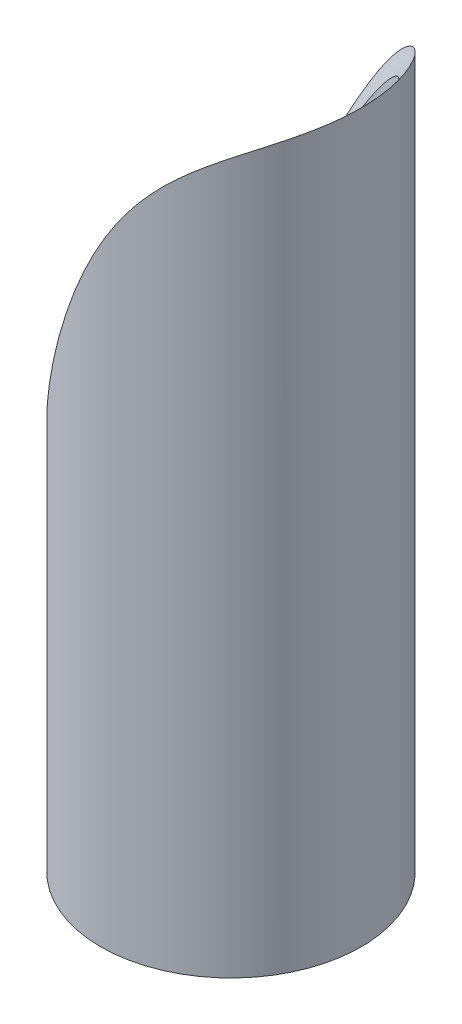
ISO-10303-21;
HEADER;
FILE_DESCRIPTION(('STEP AP214'),'2;1');
FILE_NAME('part.step','',(''),(''),'','','');
FILE_SCHEMA(('AUTOMOTIVE_DESIGN { 1 0 10303 214 1 1 1 1 }'));
ENDSEC;
DATA;
#1=APPLICATION_CONTEXT('core data for automotive mechanical design processes');
#2=APPLICATION_PROTOCOL_DEFINITION('international standard','automotive_design',2000,#1);
#3=PRODUCT_CONTEXT('',#1,'mechanical');
#4=PRODUCT('Part','Part','',(#3));
#5=PRODUCT_RELATED_PRODUCT_CATEGORY('part','',(#4));
#6=PRODUCT_DEFINITION_FORMATION('','',#4);
#7=PRODUCT_DEFINITION_CONTEXT('part definition',#1,'design');
#8=PRODUCT_DEFINITION('design','',#6,#7);
#9=PRODUCT_DEFINITION_SHAPE('','',#8);
#10=(LENGTH_UNIT() NAMED_UNIT(*) SI_UNIT(.MILLI.,.METRE.));
#11=(NAMED_UNIT(*) PLANE_ANGLE_UNIT() SI_UNIT($,.RADIAN.));
#12=(NAMED_UNIT(*) SI_UNIT($,.STERADIAN.) SOLID_ANGLE_UNIT());
#13=UNCERTAINTY_MEASURE_WITH_UNIT(LENGTH_MEASURE(1.E-05),#10,'distance_accuracy_value','');
#14=(GEOMETRIC_REPRESENTATION_CONTEXT(3) GLOBAL_UNCERTAINTY_ASSIGNED_CONTEXT((#13)) GLOBAL_UNIT_ASSIGNED_CONTEXT((#10,
#11,#12)) REPRESENTATION_CONTEXT('',''));
#15=CARTESIAN_POINT('',(0.,0.,0.));
#16=DIRECTION('',(0.,0.,1.));
#17=DIRECTION('',(1.,0.,0.));
#18=AXIS2_PLACEMENT_3D('',#15,#16,#17);
#19=CARTESIAN_POINT('',(0.,0.,0.));
#20=DIRECTION('',(0.,1.,0.));
#21=DIRECTION('',(0.,0.,1.));
#22=AXIS2_PLACEMENT_3D('',#19,#20,#21);
#23=PLANE('',#22);
#24=CARTESIAN_POINT('',(0.,0.,0.));
#25=DIRECTION('',(0.,1.,0.));
#26=DIRECTION('',(0.,0.,1.));
#27=AXIS2_PLACEMENT_3D('',#24,#25,#26);
#28=CIRCLE('',#27,11.25);
#29=CARTESIAN_POINT('',(0.,0.,11.25));
#30=VERTEX_POINT('',#29);
#31=EDGE_CURVE('E10',#30,#30,#28,.T.);
#32=ORIENTED_EDGE('',*,*,#31,.F.);
#33=EDGE_LOOP('',(#32));
#34=FACE_BOUND('',#33,.T.);
#35=CARTESIAN_POINT('',(0.,0.,0.));
#36=DIRECTION('',(0.,1.,0.));
#37=DIRECTION('',(0.,0.,1.));
#38=AXIS2_PLACEMENT_3D('',#35,#36,#37);
#39=CIRCLE('',#38,10.25);
#40=CARTESIAN_POINT('',(0.,0.,10.25));
#41=VERTEX_POINT('',#40);
#42=EDGE_CURVE('E45',#41,#41,#39,.T.);
#43=ORIENTED_EDGE('',*,*,#42,.T.);
#44=EDGE_LOOP('',(#43));
#45=FACE_BOUND('',#44,.T.);
#46=ADVANCED_FACE('F31',(#34,#45),#23,.F.);
#47=CARTESIAN_POINT('',(0.,75.,0.));
#48=DIRECTION('',(0.,-1.,0.));
#49=DIRECTION('',(0.,0.,-1.));
#50=AXIS2_PLACEMENT_3D('',#47,#48,#49);
#51=CYLINDRICAL_SURFACE('',#50,11.25);
#52=CARTESIAN_POINT('',(0.,52.5988281556523,-11.25));
#53=CARTESIAN_POINT('',(0.154801407257607,52.8669507870614,-11.2499989716801));
#54=CARTESIAN_POINT('',(0.312378840136446,53.133471297798,-11.2468104853832));
#55=CARTESIAN_POINT('',(0.633565079719813,53.6626809535256,-11.2332960558439));
#56=CARTESIAN_POINT('',(0.797173792240837,53.9253701582563,-11.2229702240124));
#57=CARTESIAN_POINT('',(1.13100626564445,54.4463302275152,-11.1942580096285));
#58=CARTESIAN_POINT('',(1.30123438401526,54.7045980146922,-11.1758662325896));
#59=CARTESIAN_POINT('',(1.64863900171999,55.2156076347191,-11.1299233075538));
#60=CARTESIAN_POINT('',(1.82581541809559,55.4683495334885,-11.1023722688834));
#61=CARTESIAN_POINT('',(2.1858285061009,55.9649346486813,-11.0371109181561));
#62=CARTESIAN_POINT('',(2.36859923755106,56.2088377971313,-10.9994950487372));
#63=CARTESIAN_POINT('',(2.74151209604992,56.6888654517424,-10.9125281841566));
#64=CARTESIAN_POINT('',(2.93165482616974,56.9249893185794,-10.8631762272141));
#65=CARTESIAN_POINT('',(3.31895617134235,57.3876191803884,-10.7511676732633));
#66=CARTESIAN_POINT('',(3.51610451896624,57.6141382635757,-10.6885299285886));
#67=CARTESIAN_POINT('',(3.91716008901634,58.0561656663875,-10.5481500682787));
#68=CARTESIAN_POINT('',(4.12106493762019,58.2716777869549,-10.4704132118462));
#69=CARTESIAN_POINT('',(4.52854076339341,58.6837131863164,-10.3005850133507));
#70=CARTESIAN_POINT('',(4.73193858617471,58.8806119941544,-10.2089937193226));
#71=CARTESIAN_POINT('',(5.14280212673697,59.2607918168509,-10.0083131205793));
#72=CARTESIAN_POINT('',(5.35026733869502,59.4440745116096,-9.89922597969307));
#73=CARTESIAN_POINT('',(5.7673230727904,59.7956270088654,-9.66219481312206));
#74=CARTESIAN_POINT('',(5.97691422352053,59.9638922178577,-9.53424504931277));
#75=CARTESIAN_POINT('',(6.39556660881948,60.2842053109016,-9.25861843849443));
#76=CARTESIAN_POINT('',(6.60462783800763,60.4362530309245,-9.1109413919916));
#77=CARTESIAN_POINT('',(7.0202870752239,60.7242256794018,-8.79469166711921));
#78=CARTESIAN_POINT('',(7.22686647243657,60.8600620896187,-8.62601370347082));
#79=CARTESIAN_POINT('',(7.63317101579305,61.1146018455879,-8.26863887816528));
#80=CARTESIAN_POINT('',(7.83289603614109,61.2333048770259,-8.07994164936192));
#81=CARTESIAN_POINT('',(8.22232302560067,61.4540995088251,-7.68330487184453));
#82=CARTESIAN_POINT('',(8.41202142821402,61.556185224854,-7.47535854757448));
#83=CARTESIAN_POINT('',(8.77832569537343,61.7446397751517,-7.0415958772153));
#84=CARTESIAN_POINT('',(8.95493191055195,61.8310090304259,-6.81578001003998));
#85=CARTESIAN_POINT('',(9.28106783921683,61.9839459981776,-6.36369973186585));
#86=CARTESIAN_POINT('',(9.43161992899726,62.0514552335934,-6.13848855945073));
#87=CARTESIAN_POINT('',(9.71726729665341,62.175000735005,-5.67549121113376));
#88=CARTESIAN_POINT('',(9.85236340989554,62.2310376211891,-5.43770571586707));
#89=CARTESIAN_POINT('',(10.1056305770277,62.3327546801559,-4.95115736334998));
#90=CARTESIAN_POINT('',(10.2238009836089,62.3784344568789,-4.70239408673966));
#91=CARTESIAN_POINT('',(10.4420277560628,62.4604709232284,-4.19555637970413));
#92=CARTESIAN_POINT('',(10.542083379633,62.4968272308258,-3.93748156823293));
#93=CARTESIAN_POINT('',(10.7265341073537,62.5623249151892,-3.40390913815107));
#94=CARTESIAN_POINT('',(10.8102030420983,62.5911453799556,-3.12812093302845));
#95=CARTESIAN_POINT('',(10.9562534631285,62.640554799936,-2.57024472796456));
#96=CARTESIAN_POINT('',(11.0186345689157,62.6611436080186,-2.28815661551485));
#97=CARTESIAN_POINT('',(11.1215641059771,62.6947139031699,-1.71953631685731));
#98=CARTESIAN_POINT('',(11.1621092489359,62.7076942444926,-1.43300346798933));
#99=CARTESIAN_POINT('',(11.2210073718398,62.7264476986934,-0.857431063047403));
#100=CARTESIAN_POINT('',(11.2393599442746,62.7322206792267,-0.568391461041443));
#101=CARTESIAN_POINT('',(11.2539725010093,62.7368233378068,0.0205770779060503));
#102=CARTESIAN_POINT('',(11.2494251746283,62.7353992862265,0.320528367315696));
#103=CARTESIAN_POINT('',(11.2164068063789,62.7249719345843,0.918985005485811));
#104=CARTESIAN_POINT('',(11.187935134393,62.7159684348955,1.21749031595394));
#105=CARTESIAN_POINT('',(11.1073174348265,62.6900747023,1.81099327784251));
#106=CARTESIAN_POINT('',(11.0551675865356,62.6731831965721,2.10599035528814));
#107=CARTESIAN_POINT('',(10.9276767194755,62.6309545151449,2.6903161630371));
#108=CARTESIAN_POINT('',(10.8523358318192,62.6056173871937,2.97964492537699));
#109=CARTESIAN_POINT('',(10.6788932315025,62.5455883460417,3.5515246535097));
#110=CARTESIAN_POINT('',(10.5807129377261,62.5108640670398,3.83404841561431));
#111=CARTESIAN_POINT('',(10.3627623344524,62.4310567701729,4.38914096099693));
#112=CARTESIAN_POINT('',(10.2429918555012,62.3859736710043,4.66170966612099));
#113=CARTESIAN_POINT('',(9.98325547678163,62.2842245160868,5.19470545000317));
#114=CARTESIAN_POINT('',(9.84329551938001,62.2275618665078,5.45513607162386));
#115=CARTESIAN_POINT('',(9.54488762615333,62.1012747491169,5.96188430658125));
#116=CARTESIAN_POINT('',(9.38644038042512,62.0316507650701,6.2082024461998));
#117=CARTESIAN_POINT('',(9.05817752006487,61.8803263878079,6.67768694495417));
#118=CARTESIAN_POINT('',(8.88884147865497,61.7990477693394,6.90132452273854));
#119=CARTESIAN_POINT('',(8.53714772559309,61.6217763848461,7.33190772627081));
#120=CARTESIAN_POINT('',(8.35479046343931,61.5257841266116,7.53885392768758));
#121=CARTESIAN_POINT('',(7.97986413869226,61.3181891060798,7.93464144498266));
#122=CARTESIAN_POINT('',(7.78730097842212,61.2065953066744,8.12349305173331));
#123=CARTESIAN_POINT('',(7.39482598682088,60.9671854584113,8.48231981051425));
#124=CARTESIAN_POINT('',(7.19491436050158,60.8393698618751,8.65229548862502));
#125=CARTESIAN_POINT('',(6.79980114786751,60.5735094293782,8.96582210948775));
#126=CARTESIAN_POINT('',(6.60478675315993,60.4361744088676,9.11021314570743));
#127=CARTESIAN_POINT('',(6.21338975436449,60.1470289830177,9.38152422613767));
#128=CARTESIAN_POINT('',(6.01700722317049,59.995219343496,9.5084451937807));
#129=CARTESIAN_POINT('',(5.6251487540203,59.677911923859,9.74539089678781));
#130=CARTESIAN_POINT('',(5.42967280910484,59.5124142490022,9.85541576206136));
#131=CARTESIAN_POINT('',(5.04149500596898,59.1688326657699,10.0595194523704));
#132=CARTESIAN_POINT('',(4.84879353226192,58.9907470326628,10.1535960862442));
#133=CARTESIAN_POINT('',(4.37340570701885,58.5324315809762,10.3698485937404));
#134=CARTESIAN_POINT('',(4.09330145477587,58.2452081123175,10.4829418959283));
#135=CARTESIAN_POINT('',(3.54543934751134,57.6499591731384,10.6806976570195));
#136=CARTESIAN_POINT('',(3.27768808914478,57.3419227997717,10.7653450736573));
#137=CARTESIAN_POINT('',(2.75485801706532,56.7083004919284,10.9108720375165));
#138=CARTESIAN_POINT('',(2.49982310003137,56.3826609011413,10.9716736423192));
#139=CARTESIAN_POINT('',(2.00330702666391,55.7183818112877,11.0730948770006));
#140=CARTESIAN_POINT('',(1.76182398758731,55.3797441290904,11.1137173165298));
#141=CARTESIAN_POINT('',(1.23194049009964,54.6050940055236,11.1863060059847));
#142=CARTESIAN_POINT('',(0.947168992660561,54.1661628977041,11.2134657634277));
#143=CARTESIAN_POINT('',(0.39534568685477,53.2764115141742,11.246446397589));
#144=CARTESIAN_POINT('',(0.128301830924536,52.8255860278051,11.2522577603104));
#145=CARTESIAN_POINT('',(-0.390700419985135,51.9145090738056,11.2462121225839));
#146=CARTESIAN_POINT('',(-0.642632459519993,51.4542429153005,11.2343251372507));
#147=CARTESIAN_POINT('',(-1.13302475633594,50.527355561092,11.1954996832938));
#148=CARTESIAN_POINT('',(-1.37148698232507,50.0607353065217,11.1685634205283));
#149=CARTESIAN_POINT('',(-1.83791113933585,49.1206081198104,11.1013661856748));
#150=CARTESIAN_POINT('',(-2.06582053050835,48.647079549695,11.0610453227123));
#151=CARTESIAN_POINT('',(-2.51159461459274,47.6964853003218,10.9684183700613));
#152=CARTESIAN_POINT('',(-2.72945901591796,47.2194195188517,10.9161119327174));
#153=CARTESIAN_POINT('',(-3.15627507147207,46.263220939552,10.8004286370438));
#154=CARTESIAN_POINT('',(-3.36523509028867,45.7840905689302,10.7370624665366));
#155=CARTESIAN_POINT('',(-3.77557064338207,44.8241192695811,10.5997342348251));
#156=CARTESIAN_POINT('',(-3.97694626190844,44.34327835992,10.5257722913652));
#157=CARTESIAN_POINT('',(-4.37994999943809,43.3637389770815,10.3647121568224));
#158=CARTESIAN_POINT('',(-4.58134098953343,42.8650036996398,10.2772452141567));
#159=CARTESIAN_POINT('',(-4.97780435928597,41.8670963538158,10.0911798648782));
#160=CARTESIAN_POINT('',(-5.17287668965155,41.3679242820572,9.99258137145559));
#161=CARTESIAN_POINT('',(-5.55745407366901,40.3695406440611,9.78391987931917));
#162=CARTESIAN_POINT('',(-5.74695636829365,39.8703291770942,9.67385131781712));
#163=CARTESIAN_POINT('',(-6.12080918477977,38.8727622605308,9.44174809150001));
#164=CARTESIAN_POINT('',(-6.30515976505072,38.3744068012892,9.31971356242435));
#165=CARTESIAN_POINT('',(-6.66871339246873,37.3802971426341,9.06312124303607));
#166=CARTESIAN_POINT('',(-6.84792647521321,36.8845396738558,8.92859040534457));
#167=CARTESIAN_POINT('',(-7.20187278466336,35.8953598052,8.64562766427636));
#168=CARTESIAN_POINT('',(-7.37660581783789,35.4019375069466,8.49719516165387));
#169=CARTESIAN_POINT('',(-7.72158731053472,34.4187903146569,8.1849678951104));
#170=CARTESIAN_POINT('',(-7.89183879049355,33.9290630977414,8.02118383583324));
#171=CARTESIAN_POINT('',(-8.22791947574881,32.9543522584756,7.67605775245971));
#172=CARTESIAN_POINT('',(-8.39374922935965,32.4693680527376,7.49471791839608));
#173=CARTESIAN_POINT('',(-8.72154253279055,31.5036077033501,7.11065062900583));
#174=CARTESIAN_POINT('',(-8.88348422330056,31.022862091255,6.90782656706569));
#175=CARTESIAN_POINT('',(-9.12247155700872,30.308672149607,6.58489802399541));
#176=CARTESIAN_POINT('',(-9.20150898967317,30.0716751409164,6.47409425970319));
#177=CARTESIAN_POINT('',(-9.35812805190799,29.6005598857152,6.24557055049142));
#178=CARTESIAN_POINT('',(-9.43570978385067,29.3664414371717,6.12785109434197));
#179=CARTESIAN_POINT('',(-9.58913848600051,28.9020565694496,5.88485669188534));
#180=CARTESIAN_POINT('',(-9.66498789406149,28.6717848774607,5.75959339778256));
#181=CARTESIAN_POINT('',(-9.81483084939069,28.2155985175579,5.50036493822041));
#182=CARTESIAN_POINT('',(-9.88882464467397,27.989683268319,5.36640094435273));
#183=CARTESIAN_POINT('',(-10.0345603542402,27.5435570515532,5.08868060478794));
#184=CARTESIAN_POINT('',(-10.1063046932424,27.3233399900059,4.94493537246398));
#185=CARTESIAN_POINT('',(-10.2471509516456,26.8899572058572,4.646041810855));
#186=CARTESIAN_POINT('',(-10.3162537032037,26.6767892655341,4.49089711840777));
#187=CARTESIAN_POINT('',(-10.4401817043327,26.2936326326905,4.19364142170156));
#188=CARTESIAN_POINT('',(-10.4954996170639,26.122264848173,4.05352149271605));
#189=CARTESIAN_POINT('',(-10.6032889303044,25.7877612874841,3.76255948534595));
#190=CARTESIAN_POINT('',(-10.6557593817256,25.6246282572905,3.61171387021482));
#191=CARTESIAN_POINT('',(-10.7568521578594,25.3098241852709,3.29842848505873));
#192=CARTESIAN_POINT('',(-10.8054885303377,25.1581114025409,3.13603562629757));
#193=CARTESIAN_POINT('',(-10.8979879360473,24.8691690693069,2.7976908065194));
#194=CARTESIAN_POINT('',(-10.9418555464026,24.7319256348092,2.62175212912071));
#195=CARTESIAN_POINT('',(-11.0240953410111,24.4743259199471,2.25133883495692));
#196=CARTESIAN_POINT('',(-11.062347144576,24.3543404458325,2.05657533191174));
#197=CARTESIAN_POINT('',(-11.130106594264,24.1416012740402,1.650849273902));
#198=CARTESIAN_POINT('',(-11.1596174183737,24.0488376793285,1.43989264153784));
#199=CARTESIAN_POINT('',(-11.1954760864168,23.9360557409691,1.11184200485293));
#200=CARTESIAN_POINT('',(-11.2060721046843,23.9027156670707,0.999719550774888));
#201=CARTESIAN_POINT('',(-11.22400884209,23.8462656180857,0.772699346627844));
#202=CARTESIAN_POINT('',(-11.2313513995961,23.8231498657595,0.657803202636138));
#203=CARTESIAN_POINT('',(-11.2425170416753,23.787994293617,0.426280433749758));
#204=CARTESIAN_POINT('',(-11.2463442976254,23.7759413463094,0.309656027171167));
#205=CARTESIAN_POINT('',(-11.2503544084071,23.7633123207174,0.075762343881968));
#206=CARTESIAN_POINT('',(-11.2505377549775,23.7627346938596,-0.0415068436801378));
#207=CARTESIAN_POINT('',(-11.2460373990854,23.7769082421571,-0.359764790173245));
#208=CARTESIAN_POINT('',(-11.2377584652613,23.8029827123095,-0.56030710633744));
#209=CARTESIAN_POINT('',(-11.2112286040107,23.8864920489831,-0.953951810980982));
#210=CARTESIAN_POINT('',(-11.1929673626846,23.943959351101,-1.1470462829247));
#211=CARTESIAN_POINT('',(-11.139699020765,24.1114539564492,-1.59285160396434));
#212=CARTESIAN_POINT('',(-11.100977869448,24.233117179621,-1.84069887920128));
#213=CARTESIAN_POINT('',(-11.0122059934901,24.5116018558724,-2.31346787237202));
#214=CARTESIAN_POINT('',(-10.9621273921233,24.6685098074866,-2.53833117253436));
#215=CARTESIAN_POINT('',(-10.8595534333836,24.9893035064058,-2.94480381302446));
#216=CARTESIAN_POINT('',(-10.8078207335857,25.1508600754071,-3.128486556683));
#217=CARTESIAN_POINT('',(-10.6995643518399,25.4883160180653,-3.48077866961164));
#218=CARTESIAN_POINT('',(-10.6430365122613,25.6642278333269,-3.6493746922476));
#219=CARTESIAN_POINT('',(-10.5262381005112,26.0269728740126,-3.97373572605711));
#220=CARTESIAN_POINT('',(-10.4659594801751,26.2138295299578,-4.12947135189077));
#221=CARTESIAN_POINT('',(-10.3425757517656,26.5954820283386,-4.42943404627317));
#222=CARTESIAN_POINT('',(-10.2794716788013,26.7902749609892,-4.57366527647725));
#223=CARTESIAN_POINT('',(-10.1176103890453,27.2887696973255,-4.92451664979462));
#224=CARTESIAN_POINT('',(-10.0173464660099,27.5965271510737,-5.12466783539948));
#225=CARTESIAN_POINT('',(-9.81273598559209,28.2221681821198,-5.50631659114274));
#226=CARTESIAN_POINT('',(-9.70838734376027,28.5400569136619,-5.68780446136649));
#227=CARTESIAN_POINT('',(-9.49619701553132,29.1837960775703,-6.03541777769712));
#228=CARTESIAN_POINT('',(-9.38834899843419,29.5096606435566,-6.20151301359449));
#229=CARTESIAN_POINT('',(-9.1698595797684,30.1668712052278,-6.52023585913213));
#230=CARTESIAN_POINT('',(-9.0592186915772,30.4982161897127,-6.67286592104796));
#231=CARTESIAN_POINT('',(-8.83473557780391,31.1672483903483,-6.96738340867453));
#232=CARTESIAN_POINT('',(-8.72087772197706,31.5049622340809,-7.10919812094507));
#233=CARTESIAN_POINT('',(-8.49081730522419,32.1837749034399,-7.38243927086515));
#234=CARTESIAN_POINT('',(-8.37461466745789,32.5248738398116,-7.51386536737567));
#235=CARTESIAN_POINT('',(-8.14012081099331,33.209324799786,-7.7672835466794));
#236=CARTESIAN_POINT('',(-8.02183225720068,33.5526736398172,-7.88928672742895));
#237=CARTESIAN_POINT('',(-7.783081760515,34.2414791374204,-8.12491612170077));
#238=CARTESIAN_POINT('',(-7.66261979872433,34.5869358133026,-8.23854226234159));
#239=CARTESIAN_POINT('',(-7.4120733450004,35.3007507374323,-8.46486243301133));
#240=CARTESIAN_POINT('',(-7.28185176524862,35.6692142999685,-8.57707202206909));
#241=CARTESIAN_POINT('',(-7.01891826952782,36.4075921868945,-8.79353465734598));
#242=CARTESIAN_POINT('',(-6.88620626732371,36.777506561169,-8.89778742741107));
#243=CARTESIAN_POINT('',(-6.48418130684153,37.8889638425896,-9.19947850705898));
#244=CARTESIAN_POINT('',(-6.21100631037492,38.6321439787231,-9.38582549231123));
#245=CARTESIAN_POINT('',(-5.65269755243134,40.1217849313293,-9.7322949882599));
#246=CARTESIAN_POINT('',(-5.36754176614006,40.8682493097968,-9.89236628561138));
#247=CARTESIAN_POINT('',(-4.78394118190259,42.3608554688799,-10.1874094591468));
#248=CARTESIAN_POINT('',(-4.48549773110605,43.1069972744897,-10.3223838725907));
#249=CARTESIAN_POINT('',(-3.87342312128761,44.5950961622145,-10.5672892282277));
#250=CARTESIAN_POINT('',(-3.55982975663269,45.337058975886,-10.6772789463276));
#251=CARTESIAN_POINT('',(-3.07486982989496,46.4462608774968,-10.8229412170072));
#252=CARTESIAN_POINT('',(-2.91076213550195,46.8154269960462,-10.8682803491085));
#253=CARTESIAN_POINT('',(-2.57713071444326,47.5520714367481,-10.9521924245421));
#254=CARTESIAN_POINT('',(-2.40760718994293,47.919549821317,-10.9907656200893));
#255=CARTESIAN_POINT('',(-2.06290451027735,48.651501406249,-11.0606408049586));
#256=CARTESIAN_POINT('',(-1.88773933072267,49.0159795890075,-11.091959392107));
#257=CARTESIAN_POINT('',(-1.53064431446129,49.7422245055143,-11.1468502265696));
#258=CARTESIAN_POINT('',(-1.34871422419384,50.1039911370169,-11.1704221832002));
#259=CARTESIAN_POINT('',(-0.977354990266478,50.8239107652433,-11.2090193204099));
#260=CARTESIAN_POINT('',(-0.787929452117535,51.1820653978482,-11.2240485580699));
#261=CARTESIAN_POINT('',(-0.400588065923039,51.8940044641958,-11.2445389833821));
#262=CARTESIAN_POINT('',(-0.202673263844406,52.2477894294488,-11.2500013463247));
#263=CARTESIAN_POINT('',(0.,52.5988281556523,-11.25));
#264=B_SPLINE_CURVE_WITH_KNOTS('',3,(#52,#53,#54,#55,#56,#57,#58,#59,#60,#61,#62,#63,#64,#65,
#66,#67,#68,#69,#70,#71,#72,#73,#74,#75,#76,#77,#78,#79,#80,#81,#82,#83,#84,#85,#86,#87,#88,#89,
#90,#91,#92,#93,#94,#95,#96,#97,#98,#99,#100,#101,#102,#103,#104,#105,#106,#107,#108,#109,#110,
#111,#112,#113,#114,#115,#116,#117,#118,#119,#120,#121,#122,#123,#124,#125,#126,#127,#128,#129,
#130,#131,#132,#133,#134,#135,#136,#137,#138,#139,#140,#141,#142,#143,#144,#145,#146,#147,#148,
#149,#150,#151,#152,#153,#154,#155,#156,#157,#158,#159,#160,#161,#162,#163,#164,#165,#166,#167,
#168,#169,#170,#171,#172,#173,#174,#175,#176,#177,#178,#179,#180,#181,#182,#183,#184,#185,#186,
#187,#188,#189,#190,#191,#192,#193,#194,#195,#196,#197,#198,#199,#200,#201,#202,#203,#204,#205,
#206,#207,#208,#209,#210,#211,#212,#213,#214,#215,#216,#217,#218,#219,#220,#221,#222,#223,#224,
#225,#226,#227,#228,#229,#230,#231,#232,#233,#234,#235,#236,#237,#238,#239,#240,#241,#242,#243,
#244,#245,#246,#247,#248,#249,#250,#251,#252,#253,#254,#255,#256,#257,#258,#259,#260,#261,#262,
#263),.UNSPECIFIED.,.T.,.F.,(4,2,2,2,2,2,2,2,2,2,2,2,2,2,2,2,2,2,2,2,2,2,2,2,2,2,2,2,2,2,2,2,2,
2,2,2,2,2,2,2,2,2,2,2,2,2,2,2,2,2,2,2,2,2,2,2,2,2,2,2,2,2,2,2,2,2,2,2,2,2,2,2,2,2,2,2,2,2,2,2,2,
2,2,2,2,2,2,2,2,2,2,2,2,2,2,2,2,2,2,2,2,2,2,2,2,4),(0.,0.928764349924019,1.85751420255035,
2.78688615054936,3.71624700580528,4.63717580772555,5.55818010644128,6.47788615393794,
7.39727242933942,8.28910369299138,9.18082474280042,10.0728176214798,10.9648195211935,
11.8614884586696,12.7581738435797,13.6551760648714,14.5521542541356,15.3887580749839,
16.2253166575896,17.0619072251055,17.8985320664378,18.7664651889893,19.6344138241518,
20.5024931286769,21.3705883730367,22.2694971015146,23.1684295061167,24.0675070140204,
24.9665794389918,25.8687921942239,26.7710120309167,27.6729668571348,28.5748880257846,
29.4499281154882,30.3249380130177,31.199447278184,32.07393216427,32.9094414815601,
33.7449066185451,34.5803653315472,35.4159387371491,36.664356398538,37.9134331917343,
39.1665593528992,40.4195109858363,41.9901569149736,43.5615027238478,45.1355137684482,
46.7092941618105,48.2902137301166,49.8711791606104,51.4506251641822,53.0300536176616,
54.6646800081055,56.299319147134,57.934754780845,59.5701718646677,61.2021400711008,
62.8341786576327,64.4650875715358,66.0957932957296,67.7341708424176,68.5539808036719,
69.3737328939769,70.1922497490718,71.0106566144754,71.8281486567894,72.6453810128043,
73.3295454946501,74.0139366323341,74.6956908329622,75.376784788821,76.0708320222479,
76.7646266080364,77.1165444859276,77.4682632582509,77.8195641277936,78.1708175896106,
78.7746934950117,79.379194518414,80.2108494798967,81.044568255021,81.7935695643186,
82.5432270670917,83.2945526507448,84.0456052018897,85.1864414257105,86.3278676129117,
87.4714885593142,88.6149007978135,89.7654240862888,90.9159851397063,92.0651697600234,
93.2143643772312,94.4340301961765,95.6537383263326,98.0934093718912,100.537780469625,
102.981904310321,105.420217447157,106.639745090694,107.85922726404,109.075891200779,
110.292600786283,111.50873205211,112.724713905739),.UNSPECIFIED.);
#265=CARTESIAN_POINT('',(0.,52.5988281556523,-11.25));
#266=VERTEX_POINT('',#265);
#267=EDGE_CURVE('E49',#266,#266,#264,.T.);
#268=ORIENTED_EDGE('',*,*,#267,.T.);
#269=EDGE_LOOP('',(#268));
#270=FACE_BOUND('',#269,.T.);
#271=ORIENTED_EDGE('',*,*,#31,.T.);
#272=EDGE_LOOP('',(#271));
#273=FACE_BOUND('',#272,.T.);
#274=ADVANCED_FACE('F33',(#270,#273),#51,.T.);
#275=CARTESIAN_POINT('',(0.,75.,0.));
#276=DIRECTION('',(0.,-1.,0.));
#277=DIRECTION('',(0.,0.,-1.));
#278=AXIS2_PLACEMENT_3D('',#275,#276,#277);
#279=CYLINDRICAL_SURFACE('',#278,10.25);
#280=CARTESIAN_POINT('',(0.,50.7551551871332,-10.25));
#281=CARTESIAN_POINT('',(0.270103689978766,51.2229847023899,-10.250001014025));
#282=CARTESIAN_POINT('',(0.548034078918775,51.6863616383892,-10.2393880135718));
#283=CARTESIAN_POINT('',(0.978148331872058,52.3722410956576,-10.2042319535863));
#284=CARTESIAN_POINT('',(1.12375516084511,52.5993838119898,-10.1893019631088));
#285=CARTESIAN_POINT('',(1.41959598856215,53.0500654253298,-10.152314613035));
#286=CARTESIAN_POINT('',(1.56982997693807,53.2736043304109,-10.1302572694079));
#287=CARTESIAN_POINT('',(1.8745249982932,53.715624359701,-10.0783156434683));
#288=CARTESIAN_POINT('',(2.02896804624333,53.9341213202964,-10.0484610536237));
#289=CARTESIAN_POINT('',(2.34271213473966,54.3661921739927,-9.97997903528551));
#290=CARTESIAN_POINT('',(2.50201281979424,54.5797664253483,-9.9413522474314));
#291=CARTESIAN_POINT('',(2.8253738051856,55.0010456286286,-9.85432788133743));
#292=CARTESIAN_POINT('',(2.98943094747334,55.2087543019791,-9.80593666448822));
#293=CARTESIAN_POINT('',(3.32220531364194,55.6174623487805,-9.69824872506009));
#294=CARTESIAN_POINT('',(3.49092168064776,55.8184629410902,-9.63895399653703));
#295=CARTESIAN_POINT('',(3.85422556910348,56.2376113697467,-9.49999437613398));
#296=CARTESIAN_POINT('',(4.04939297174284,56.4547259706016,-9.41870376951077));
#297=CARTESIAN_POINT('',(4.44420928052305,56.8774935277994,-9.23896813202292));
#298=CARTESIAN_POINT('',(4.64385769438543,57.0831477346054,-9.14052497755806));
#299=CARTESIAN_POINT('',(5.04604543306552,57.4812287533014,-8.92479476502453));
#300=CARTESIAN_POINT('',(5.248583619353,57.6736606098114,-8.80751495119813));
#301=CARTESIAN_POINT('',(5.6544545394702,58.0437196215467,-8.55260483291697));
#302=CARTESIAN_POINT('',(5.85778727490845,58.2213467467841,-8.41497448724272));
#303=CARTESIAN_POINT('',(6.2645534873996,58.5621154057144,-8.11677861558689));
#304=CARTESIAN_POINT('',(6.46796610783022,58.7250874655303,-7.95598987883357));
#305=CARTESIAN_POINT('',(6.86933467307499,59.0333668369362,-7.6121316486451));
#306=CARTESIAN_POINT('',(7.06729057042222,59.1786739949004,-7.42906196146756));
#307=CARTESIAN_POINT('',(7.45397535899656,59.4510540867234,-7.04100492906829));
#308=CARTESIAN_POINT('',(7.64270635354551,59.5781311900281,-6.83602261432071));
#309=CARTESIAN_POINT('',(8.00723380297641,59.8141288823185,-6.40517722217934));
#310=CARTESIAN_POINT('',(8.18303166061436,59.923051442012,-6.17931641532597));
#311=CARTESIAN_POINT('',(8.49736892448688,60.1108637195544,-5.73770975702816));
#312=CARTESIAN_POINT('',(8.63782407199871,60.1918032994073,-5.5241914167341));
#313=CARTESIAN_POINT('',(8.90405670025705,60.3408082199568,-5.08393843611709));
#314=CARTESIAN_POINT('',(9.0298354702604,60.4088746918274,-4.85720495931506));
#315=CARTESIAN_POINT('',(9.26494561085068,60.5328663457898,-4.39217260205693));
#316=CARTESIAN_POINT('',(9.3742758802772,60.5887907151281,-4.1538729487034));
#317=CARTESIAN_POINT('',(9.57501809571645,60.689250753182,-3.66752448470742));
#318=CARTESIAN_POINT('',(9.66642995838382,60.7337863689243,-3.41947562872414));
#319=CARTESIAN_POINT('',(9.82729361660985,60.8107944382799,-2.92440547313933));
#320=CARTESIAN_POINT('',(9.89740537534711,60.8436364670781,-2.67765559144694));
#321=CARTESIAN_POINT('',(10.0190934297064,60.8999211681973,-2.17858527453541));
#322=CARTESIAN_POINT('',(10.0706703443873,60.9233641544468,-1.92626502566388));
#323=CARTESIAN_POINT('',(10.1547380812442,60.9612689922048,-1.41781242826417));
#324=CARTESIAN_POINT('',(10.1872296943636,60.9757312159005,-1.16168023816365));
#325=CARTESIAN_POINT('',(10.2327950262294,60.9959465968004,-0.647350002178466));
#326=CARTESIAN_POINT('',(10.24586835461,61.0016995789227,-0.38915191486796));
#327=CARTESIAN_POINT('',(10.2525164066137,61.0046300746095,0.131780523615583));
#328=CARTESIAN_POINT('',(10.2457680341177,61.0016654898976,0.394519863450632));
#329=CARTESIAN_POINT('',(10.2121423450612,60.9867940914506,0.918454971610836));
#330=CARTESIAN_POINT('',(10.1852648388506,60.9748871934639,1.17965072536946));
#331=CARTESIAN_POINT('',(10.1116631164313,60.9418975233111,1.69866746084607));
#332=CARTESIAN_POINT('',(10.0649373418069,60.9208140306282,1.9564881759291));
#333=CARTESIAN_POINT('',(9.9521489910527,60.8690762525098,2.46688776817489));
#334=CARTESIAN_POINT('',(9.88608648777004,60.8384220031303,2.71946666508129));
#335=CARTESIAN_POINT('',(9.7352541736985,60.7669482419434,3.21795624481208));
#336=CARTESIAN_POINT('',(9.65045441923508,60.7261124456179,3.46385553865943));
#337=CARTESIAN_POINT('',(9.46322694118829,60.6336515886483,3.94675744895671));
#338=CARTESIAN_POINT('',(9.36079922847213,60.5820265346555,4.18376007089113));
#339=CARTESIAN_POINT('',(9.13965253597593,60.467295633244,4.64705441748565));
#340=CARTESIAN_POINT('',(9.02093873571586,60.4041934338706,4.87334951684485));
#341=CARTESIAN_POINT('',(8.76879212263915,60.2657932332346,5.31367536716769));
#342=CARTESIAN_POINT('',(8.63535960764062,60.1904954787222,5.52770636614973));
#343=CARTESIAN_POINT('',(8.35789053978001,60.0283867603811,5.93874317942271));
#344=CARTESIAN_POINT('',(8.21405688624331,59.941778419018,6.13596597138161));
#345=CARTESIAN_POINT('',(7.91599917969593,59.7557209973787,6.5159623919265));
#346=CARTESIAN_POINT('',(7.7617753583871,59.6562722034007,6.69873634252577));
#347=CARTESIAN_POINT('',(7.4451683774426,59.4443512490422,7.04894936143035));
#348=CARTESIAN_POINT('',(7.28278658701475,59.3318812699903,7.21639098983678));
#349=CARTESIAN_POINT('',(6.95211511401017,59.0939868824123,7.53547579254029));
#350=CARTESIAN_POINT('',(6.78382532853629,58.9685622481863,7.68711869149464));
#351=CARTESIAN_POINT('',(6.44174548474495,58.7037290320184,7.97603177590124));
#352=CARTESIAN_POINT('',(6.26791581764838,58.5641850425745,8.11313059475362));
#353=CARTESIAN_POINT('',(5.91863020455235,58.2729356005297,8.37134986580023));
#354=CARTESIAN_POINT('',(5.7431742732046,58.1212302574014,8.49247046179957));
#355=CARTESIAN_POINT('',(5.3924664619631,57.8065428358088,8.71937154941526));
#356=CARTESIAN_POINT('',(5.21721459620664,57.6435600184182,8.82515103443822));
#357=CARTESIAN_POINT('',(4.86839566017226,57.3073453988625,9.02227078973654));
#358=CARTESIAN_POINT('',(4.69482905162794,57.1341108752677,9.11360720209406));
#359=CARTESIAN_POINT('',(4.24149093419795,56.6658140312828,9.33651489658798));
#360=CARTESIAN_POINT('',(3.96409213550218,56.3630944138265,9.45692137850533));
#361=CARTESIAN_POINT('',(3.42010368080506,55.7378985935736,9.66698126558148));
#362=CARTESIAN_POINT('',(3.15352083218118,55.4154102596637,9.7566155601061));
#363=CARTESIAN_POINT('',(2.63168222852655,54.7538343772544,9.91014386449242));
#364=CARTESIAN_POINT('',(2.3764669228447,54.4146953788432,9.97395161963965));
#365=CARTESIAN_POINT('',(1.87845951600253,53.7242947578168,10.0796166663956));
#366=CARTESIAN_POINT('',(1.63566580011965,53.3730347208458,10.1214768176203));
#367=CARTESIAN_POINT('',(1.15997965772108,52.6581775672736,10.1870034296348));
#368=CARTESIAN_POINT('',(0.927182721392492,52.2945038749598,10.2105206486723));
#369=CARTESIAN_POINT('',(0.472627362904722,51.5595959296341,10.2416316030079));
#370=CARTESIAN_POINT('',(0.250871529234076,51.1883599321849,10.2492216213164));
#371=CARTESIAN_POINT('',(-0.182771780109775,50.4397113889026,10.2506652672057));
#372=CARTESIAN_POINT('',(-0.394649700136125,50.0622933207209,10.2445058643291));
#373=CARTESIAN_POINT('',(-0.809312341412586,49.3029435195978,10.2201093386688));
#374=CARTESIAN_POINT('',(-1.01209772312411,48.9210121170495,10.2018730946419));
#375=CARTESIAN_POINT('',(-1.40981695548219,48.1530847878587,10.1545590423206));
#376=CARTESIAN_POINT('',(-1.60473938262974,47.7670839074172,10.1254660481411));
#377=CARTESIAN_POINT('',(-1.98728895092793,46.9923577628345,10.0573814331074));
#378=CARTESIAN_POINT('',(-2.17491600604258,46.6036324666275,10.0183896955557));
#379=CARTESIAN_POINT('',(-2.54352217440523,45.82435324612,9.9312053166953));
#380=CARTESIAN_POINT('',(-2.72450505715914,45.4338005049787,9.88301799169717));
#381=CARTESIAN_POINT('',(-3.08059610226339,44.6511966017661,9.77787722009228));
#382=CARTESIAN_POINT('',(-3.25570412259334,44.2591454037257,9.72092356175171));
#383=CARTESIAN_POINT('',(-3.64166608923117,43.3805843068796,9.58395126877262));
#384=CARTESIAN_POINT('',(-3.8511063736526,42.8938051803812,9.50166945458101));
#385=CARTESIAN_POINT('',(-4.26275439602345,41.9195243118644,9.32425053382868));
#386=CARTESIAN_POINT('',(-4.46496193590938,41.4320225504373,9.22911307556577));
#387=CARTESIAN_POINT('',(-4.86300256268067,40.4567417271295,9.02572404617245));
#388=CARTESIAN_POINT('',(-5.05883113177446,39.9689627073926,8.91746342643689));
#389=CARTESIAN_POINT('',(-5.44453039798241,38.9942644192635,8.68734831852952));
#390=CARTESIAN_POINT('',(-5.6344012249406,38.5073451323526,8.56549412688237));
#391=CARTESIAN_POINT('',(-6.00946629670792,37.532983834984,8.30668268345249));
#392=CARTESIAN_POINT('',(-6.19463502615057,37.0455497142314,8.16965856776321));
#393=CARTESIAN_POINT('',(-6.55966371512028,36.0734075395609,7.8795739254838));
#394=CARTESIAN_POINT('',(-6.73952328785665,35.5886996863333,7.72651223417771));
#395=CARTESIAN_POINT('',(-7.09377877444253,34.6239864363894,7.40259065108316));
#396=CARTESIAN_POINT('',(-7.26818125889981,34.1439759036043,7.23175332622682));
#397=CARTESIAN_POINT('',(-7.61159670058262,33.1898975206601,6.86938874937728));
#398=CARTESIAN_POINT('',(-7.78061071404995,32.7158285170443,6.67786558489723));
#399=CARTESIAN_POINT('',(-8.03072223721442,32.0083807472682,6.3708420369023));
#400=CARTESIAN_POINT('',(-8.1140091218692,31.7717790261393,6.2645190394665));
#401=CARTESIAN_POINT('',(-8.27895910042762,31.3012926984903,6.04485108502984));
#402=CARTESIAN_POINT('',(-8.36062230950038,31.0674078997486,5.93150662843299));
#403=CARTESIAN_POINT('',(-8.52232352487622,30.6025254767807,5.69674087622148));
#404=CARTESIAN_POINT('',(-8.60235810982562,30.3715342579685,5.57530449121988));
#405=CARTESIAN_POINT('',(-8.76040404148225,29.9137500613922,5.32352528452609));
#406=CARTESIAN_POINT('',(-8.83841551812679,29.6869568142759,5.19318303679103));
#407=CARTESIAN_POINT('',(-8.99113639700722,29.2414731503856,4.92398465092428));
#408=CARTESIAN_POINT('',(-9.06587474758994,29.0227171344705,4.78525410643407));
#409=CARTESIAN_POINT('',(-9.21262645856323,28.5918472406798,4.49625405105845));
#410=CARTESIAN_POINT('',(-9.28463891183891,28.3797355778696,4.34598074853957));
#411=CARTESIAN_POINT('',(-9.42499274954181,27.9651398211252,4.03254437934135));
#412=CARTESIAN_POINT('',(-9.49334577412941,27.7626254686484,3.86942683562529));
#413=CARTESIAN_POINT('',(-9.62559783898071,27.3697732711158,3.52759926107645));
#414=CARTESIAN_POINT('',(-9.68950112865843,27.1794238234925,3.34890448399917));
#415=CARTESIAN_POINT('',(-9.78057610604568,26.9075155911457,3.06795708430709));
#416=CARTESIAN_POINT('',(-9.81001027436024,26.8195315043868,2.97263554847374));
#417=CARTESIAN_POINT('',(-9.86715284428951,26.648538209204,2.77708197841918));
#418=CARTESIAN_POINT('',(-9.89486097946694,26.5655297689149,2.67684919032304));
#419=CARTESIAN_POINT('',(-9.948226929827,26.4054975097441,2.47114675211315));
#420=CARTESIAN_POINT('',(-9.97388461331185,26.3284740752803,2.36567676632544));
#421=CARTESIAN_POINT('',(-10.0227408256844,26.1816801105357,2.14929511127785));
#422=CARTESIAN_POINT('',(-10.0459398287407,26.1119081818168,2.03838449732746));
#423=CARTESIAN_POINT('',(-10.1033944692998,25.9389782728545,1.73783715058918));
#424=CARTESIAN_POINT('',(-10.1351891501564,25.843136489841,1.54336318762941));
#425=CARTESIAN_POINT('',(-10.1883552251302,25.6827421155334,1.14057884343689));
#426=CARTESIAN_POINT('',(-10.2097447717006,25.618135034436,0.932293284285062));
#427=CARTESIAN_POINT('',(-10.2373970929513,25.5345828545254,0.539260703896065));
#428=CARTESIAN_POINT('',(-10.2454824811211,25.5101369303915,0.355830185271779));
#429=CARTESIAN_POINT('',(-10.2516457295571,25.4915039002649,-0.012704592321113));
#430=CARTESIAN_POINT('',(-10.2497283585298,25.4973023755834,-0.197808011742653));
#431=CARTESIAN_POINT('',(-10.2361198831454,25.5384386664463,-0.563783586610147));
#432=CARTESIAN_POINT('',(-10.2244522753532,25.5737054678547,-0.744664840651442));
#433=CARTESIAN_POINT('',(-10.1925150006154,25.6701663985082,-1.09855176640231));
#434=CARTESIAN_POINT('',(-10.1722369320044,25.7313858509822,-1.27154956277136));
#435=CARTESIAN_POINT('',(-10.1121365707296,25.9126405053305,-1.69528295199903));
#436=CARTESIAN_POINT('',(-10.0676400525682,26.0466886566618,-1.93930841628092));
#437=CARTESIAN_POINT('',(-9.96721895294366,26.3485607854263,-2.40286002641789));
#438=CARTESIAN_POINT('',(-9.91126122654459,26.5164827014093,-2.62231219516569));
#439=CARTESIAN_POINT('',(-9.79546704871599,26.8630997741654,-3.02526091800089));
#440=CARTESIAN_POINT('',(-9.7361330033231,27.0403446560714,-3.21017624388726));
#441=CARTESIAN_POINT('',(-9.61240364884453,27.4090065015716,-3.56360626371995));
#442=CARTESIAN_POINT('',(-9.54800360948049,27.6004367005361,-3.73210529267961));
#443=CARTESIAN_POINT('',(-9.415256596419,27.9939297801239,-4.05536942140392));
#444=CARTESIAN_POINT('',(-9.34690103951687,28.1960156916526,-4.21010265333255));
#445=CARTESIAN_POINT('',(-9.20721158957803,28.6077543329079,-4.50740298652046));
#446=CARTESIAN_POINT('',(-9.13587888810408,28.8174040308599,-4.64997488695185));
#447=CARTESIAN_POINT('',(-8.95047657914373,29.3605651201962,-5.00099828518794));
#448=CARTESIAN_POINT('',(-8.83466392658402,29.698231404353,-5.20208791606274));
#449=CARTESIAN_POINT('',(-8.5983829020739,30.3833622117184,-5.58396224893308));
#450=CARTESIAN_POINT('',(-8.4779121494103,30.730831720073,-5.76473637844912));
#451=CARTESIAN_POINT('',(-8.23286758619306,31.4333933024326,-6.1095990013095));
#452=CARTESIAN_POINT('',(-8.10828638990138,31.7884986478641,-6.27365502099308));
#453=CARTESIAN_POINT('',(-7.85571121592983,32.503774009341,-6.5871684539971));
#454=CARTESIAN_POINT('',(-7.72771787669413,32.8639430720387,-6.73662857427955));
#455=CARTESIAN_POINT('',(-7.46784529932083,33.5900846844777,-7.02363525718867));
#456=CARTESIAN_POINT('',(-7.33594883105682,33.9560780541105,-7.16111324414373));
#457=CARTESIAN_POINT('',(-7.0690515799186,34.6910153438078,-7.42470052003792));
#458=CARTESIAN_POINT('',(-6.9340506861842,35.0599593689335,-7.55080940218836));
#459=CARTESIAN_POINT('',(-6.66112607200842,35.7996505715266,-7.79263118203519));
#460=CARTESIAN_POINT('',(-6.52320574417212,36.1703953076122,-7.90835540716259));
#461=CARTESIAN_POINT('',(-6.24424731960774,36.9135245097047,-8.13041456639885));
#462=CARTESIAN_POINT('',(-6.10320912107819,37.2859090289332,-8.2367491933605));
#463=CARTESIAN_POINT('',(-5.75024900714178,38.2087399263704,-8.48905401705723));
#464=CARTESIAN_POINT('',(-5.5364352160801,38.7598685469207,-8.62990203235822));
#465=CARTESIAN_POINT('',(-5.10124202038834,39.8633568101122,-8.89407648316333));
#466=CARTESIAN_POINT('',(-4.87986215838351,40.4157165252806,-9.01740185707806));
#467=CARTESIAN_POINT('',(-4.42850000861114,41.5210647306167,-9.24743851574205));
#468=CARTESIAN_POINT('',(-4.19850918231552,42.0740532878031,-9.35413273744665));
#469=CARTESIAN_POINT('',(-3.72906962259388,43.1789405221929,-9.55098546615615));
#470=CARTESIAN_POINT('',(-3.48962124261153,43.7308392393174,-9.6411445903944));
#471=CARTESIAN_POINT('',(-3.00074709909755,44.8304063186742,-9.80429496561526));
#472=CARTESIAN_POINT('',(-2.75135934442674,45.3780827311658,-9.87734541926144));
#473=CARTESIAN_POINT('',(-2.240110635607,46.4697806285926,-10.0056932682583));
#474=CARTESIAN_POINT('',(-1.97824844493313,47.0138017450735,-10.0609888994446));
#475=CARTESIAN_POINT('',(-1.44035213259591,48.0956575480307,-10.1519567080593));
#476=CARTESIAN_POINT('',(-1.1643360624885,48.6334990938906,-10.1876532330929));
#477=CARTESIAN_POINT('',(-0.595485794773915,49.7011408392372,-10.2366711621197));
#478=CARTESIAN_POINT('',(-0.302656354772837,50.2309432603956,-10.2499988637656));
#479=CARTESIAN_POINT('',(0.,50.7551551871332,-10.25));
#480=B_SPLINE_CURVE_WITH_KNOTS('',3,(#280,#281,#282,#283,#284,#285,#286,#287,#288,#289,#290,
#291,#292,#293,#294,#295,#296,#297,#298,#299,#300,#301,#302,#303,#304,#305,#306,#307,#308,#309,
#310,#311,#312,#313,#314,#315,#316,#317,#318,#319,#320,#321,#322,#323,#324,#325,#326,#327,#328,
#329,#330,#331,#332,#333,#334,#335,#336,#337,#338,#339,#340,#341,#342,#343,#344,#345,#346,#347,
#348,#349,#350,#351,#352,#353,#354,#355,#356,#357,#358,#359,#360,#361,#362,#363,#364,#365,#366,
#367,#368,#369,#370,#371,#372,#373,#374,#375,#376,#377,#378,#379,#380,#381,#382,#383,#384,#385,
#386,#387,#388,#389,#390,#391,#392,#393,#394,#395,#396,#397,#398,#399,#400,#401,#402,#403,#404,
#405,#406,#407,#408,#409,#410,#411,#412,#413,#414,#415,#416,#417,#418,#419,#420,#421,#422,#423,
#424,#425,#426,#427,#428,#429,#430,#431,#432,#433,#434,#435,#436,#437,#438,#439,#440,#441,#442,
#443,#444,#445,#446,#447,#448,#449,#450,#451,#452,#453,#454,#455,#456,#457,#458,#459,#460,#461,
#462,#463,#464,#465,#466,#467,#468,#469,#470,#471,#472,#473,#474,#475,#476,#477,#478,#479),
.UNSPECIFIED.,.T.,.F.,(4,2,2,2,2,2,2,2,2,2,2,2,2,2,2,2,2,2,2,2,2,2,2,2,2,2,2,2,2,2,2,2,2,2,2,2,
2,2,2,2,2,2,2,2,2,2,2,2,2,2,2,2,2,2,2,2,2,2,2,2,2,2,2,2,2,2,2,2,2,2,2,2,2,2,2,2,2,2,2,2,2,2,2,2,
2,2,2,2,2,2,2,2,2,2,2,2,2,2,2,4),(0.,1.62036531131258,2.4308920091381,3.24141689094929,
4.04889913368096,4.85632242439648,5.66322137856653,6.46997291195045,7.37844018763691,
8.28680814403908,9.19482759119554,10.1028488775476,11.0202941811458,11.9377474628932,
12.8549905756941,13.7721340552009,14.5753734775577,15.3785422855684,16.1817648385711,
16.9849911275805,17.7599318586488,18.5348467044958,19.3097294336353,20.0846277400365,
20.8722267102345,21.659833101024,22.4475013433081,23.2351666182516,24.0240998703234,
24.8130326360378,25.6017150739357,26.3903815565786,27.1664783968616,27.9425579358275,
28.7185076523859,29.4944708900554,30.2787464895981,31.0630150301243,31.8473350064774,
32.631864131496,33.9133743287942,35.1956789563488,36.4822315342581,37.7686164418735,
39.0653615138231,40.3624091783204,41.6606865890548,42.9588695425755,44.2588751781991,
45.5588961404372,46.8581677768867,48.1574707996528,49.7660727120031,51.3747186410837,
52.9844801318541,54.5942065148069,56.2113339855509,57.8285789803791,59.44379530096,
61.0586930373843,61.8759155677487,62.6930799233078,63.5118132011753,64.3304937637248,
65.139024082887,65.9478211381127,66.753870573732,67.5591393794178,67.9580360148807,
68.3569940737903,68.7559777366834,69.1548843130618,69.8098361309188,70.4636412068611,
71.0167323424648,71.569559821989,72.1210589016053,72.6730973480562,73.5141035170592,
74.3575770505611,75.1451825222666,75.9335323401763,76.7236621171373,77.5134786320963,
78.7417231056164,79.9706038438537,81.2018278271286,82.4328230316746,83.6704550720565,
84.9081313775835,86.1444408030987,87.380790655098,89.2035461359524,91.026411999341,
92.8511359284837,94.6757917292216,96.4940370071799,98.3124628947487,100.128624644724,
101.944274992044),.UNSPECIFIED.);
#481=CARTESIAN_POINT('',(0.,50.7551551871332,-10.25));
#482=VERTEX_POINT('',#481);
#483=EDGE_CURVE('E36',#482,#482,#480,.T.);
#484=ORIENTED_EDGE('',*,*,#483,.F.);
#485=EDGE_LOOP('',(#484));
#486=FACE_BOUND('',#485,.T.);
#487=ORIENTED_EDGE('',*,*,#42,.F.);
#488=EDGE_LOOP('',(#487));
#489=FACE_BOUND('',#488,.T.);
#490=ADVANCED_FACE('F59',(#486,#489),#279,.F.);
#491=CARTESIAN_POINT('',(-37.7290615107834,9.65134854143244,0.));
#492=DIRECTION('',(0.500000000000004,0.866025403784436,0.));
#493=DIRECTION('',(-0.866025403784436,0.500000000000004,0.));
#494=AXIS2_PLACEMENT_3D('',#491,#492,#493);
#495=CYLINDRICAL_SURFACE('',#494,15.875);
#496=ORIENTED_EDGE('',*,*,#483,.T.);
#497=EDGE_LOOP('',(#496));
#498=FACE_BOUND('',#497,.T.);
#499=ORIENTED_EDGE('',*,*,#267,.F.);
#500=EDGE_LOOP('',(#499));
#501=FACE_BOUND('',#500,.T.);
#502=ADVANCED_FACE('F56',(#498,#501),#495,.F.);
#503=CLOSED_SHELL('',(#46,#274,#490,#502));
#504=MANIFOLD_SOLID_BREP('B2',#503);
#505=ADVANCED_BREP_SHAPE_REPRESENTATION('',(#18,#504),#14);
#506=SHAPE_DEFINITION_REPRESENTATION(#9,#505);
ENDSEC;
END-ISO-10303-21;
